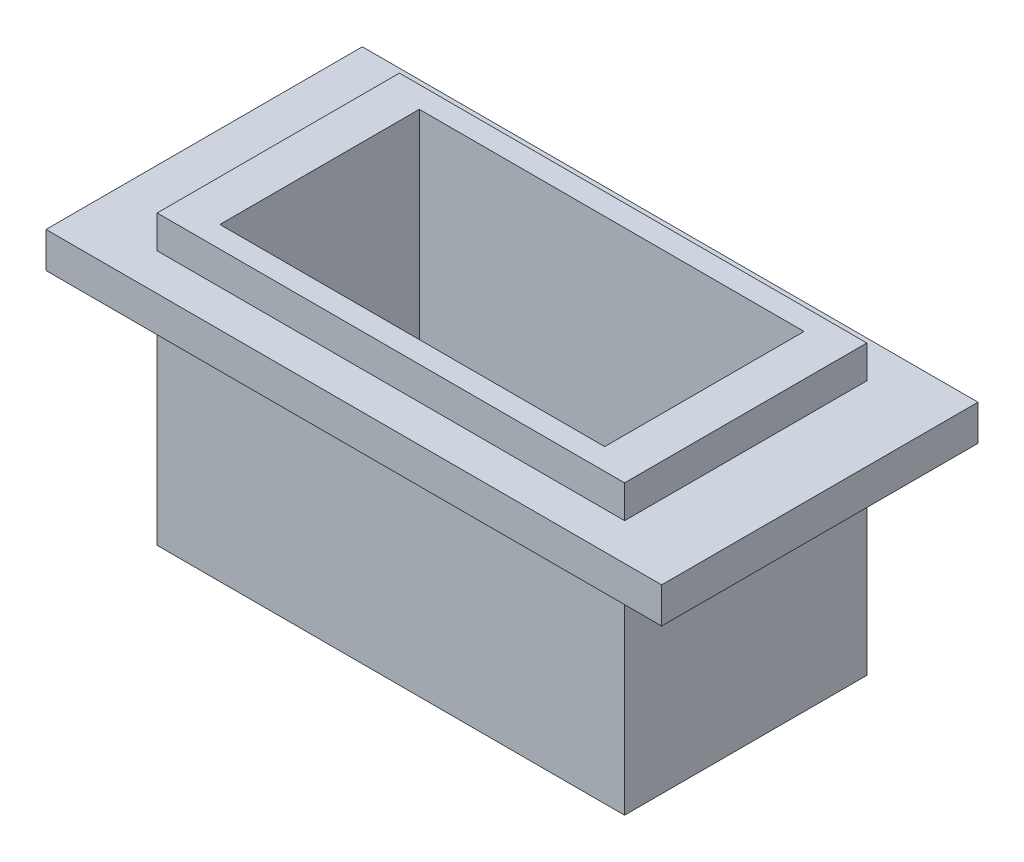
ISO-10303-21;
HEADER;
FILE_DESCRIPTION(('STEP AP214'),'2;1');
FILE_NAME('part.step','',(''),(''),'','','');
FILE_SCHEMA(('AUTOMOTIVE_DESIGN { 1 0 10303 214 1 1 1 1 }'));
ENDSEC;
DATA;
#1=APPLICATION_CONTEXT('core data for automotive mechanical design processes');
#2=APPLICATION_PROTOCOL_DEFINITION('international standard','automotive_design',2000,#1);
#3=PRODUCT_CONTEXT('',#1,'mechanical');
#4=PRODUCT('Part','Part','',(#3));
#5=PRODUCT_RELATED_PRODUCT_CATEGORY('part','',(#4));
#6=PRODUCT_DEFINITION_FORMATION('','',#4);
#7=PRODUCT_DEFINITION_CONTEXT('part definition',#1,'design');
#8=PRODUCT_DEFINITION('design','',#6,#7);
#9=PRODUCT_DEFINITION_SHAPE('','',#8);
#10=(LENGTH_UNIT() NAMED_UNIT(*) SI_UNIT(.MILLI.,.METRE.));
#11=(NAMED_UNIT(*) PLANE_ANGLE_UNIT() SI_UNIT($,.RADIAN.));
#12=(NAMED_UNIT(*) SI_UNIT($,.STERADIAN.) SOLID_ANGLE_UNIT());
#13=UNCERTAINTY_MEASURE_WITH_UNIT(LENGTH_MEASURE(1.E-05),#10,'distance_accuracy_value','');
#14=(GEOMETRIC_REPRESENTATION_CONTEXT(3) GLOBAL_UNCERTAINTY_ASSIGNED_CONTEXT((#13)) GLOBAL_UNIT_ASSIGNED_CONTEXT((#10,
#11,#12)) REPRESENTATION_CONTEXT('',''));
#15=CARTESIAN_POINT('',(0.,0.,0.));
#16=DIRECTION('',(0.,0.,1.));
#17=DIRECTION('',(1.,0.,0.));
#18=AXIS2_PLACEMENT_3D('',#15,#16,#17);
#19=CARTESIAN_POINT('',(0.,3.175,0.));
#20=DIRECTION('',(0.,0.,-1.));
#21=DIRECTION('',(-1.,0.,0.));
#22=AXIS2_PLACEMENT_3D('',#19,#20,#21);
#23=PLANE('',#22);
#24=DIRECTION('',(1.,0.,0.));
#25=VECTOR('',#24,1.);
#26=CARTESIAN_POINT('',(0.,0.,0.));
#27=LINE('',#26,#25);
#28=CARTESIAN_POINT('',(0.,0.,0.));
#29=VERTEX_POINT('',#28);
#30=CARTESIAN_POINT('',(54.864,0.,0.));
#31=VERTEX_POINT('',#30);
#32=EDGE_CURVE('E134',#29,#31,#27,.T.);
#33=ORIENTED_EDGE('',*,*,#32,.T.);
#34=DIRECTION('',(0.,-1.,0.));
#35=VECTOR('',#34,1.);
#36=CARTESIAN_POINT('',(54.864,3.175,0.));
#37=LINE('',#36,#35);
#38=CARTESIAN_POINT('',(54.864,3.175,0.));
#39=VERTEX_POINT('',#38);
#40=EDGE_CURVE('E11',#39,#31,#37,.T.);
#41=ORIENTED_EDGE('',*,*,#40,.F.);
#42=DIRECTION('',(1.,0.,0.));
#43=VECTOR('',#42,1.);
#44=CARTESIAN_POINT('',(0.,3.175,0.));
#45=LINE('',#44,#43);
#46=CARTESIAN_POINT('',(0.,3.175,0.));
#47=VERTEX_POINT('',#46);
#48=EDGE_CURVE('E151',#47,#39,#45,.T.);
#49=ORIENTED_EDGE('',*,*,#48,.F.);
#50=DIRECTION('',(0.,-1.,0.));
#51=VECTOR('',#50,1.);
#52=CARTESIAN_POINT('',(0.,3.175,0.));
#53=LINE('',#52,#51);
#54=EDGE_CURVE('E109',#47,#29,#53,.T.);
#55=ORIENTED_EDGE('',*,*,#54,.T.);
#56=EDGE_LOOP('',(#33,#41,#49,#55));
#57=FACE_BOUND('',#56,.T.);
#58=ADVANCED_FACE('F35',(#57),#23,.F.);
#59=CARTESIAN_POINT('',(54.864,3.175,0.));
#60=DIRECTION('',(-1.,0.,0.));
#61=DIRECTION('',(0.,0.,1.));
#62=AXIS2_PLACEMENT_3D('',#59,#60,#61);
#63=PLANE('',#62);
#64=DIRECTION('',(0.,0.,-1.));
#65=VECTOR('',#64,1.);
#66=CARTESIAN_POINT('',(54.864,0.,0.));
#67=LINE('',#66,#65);
#68=CARTESIAN_POINT('',(54.864,0.,-28.194));
#69=VERTEX_POINT('',#68);
#70=EDGE_CURVE('E137',#31,#69,#67,.T.);
#71=ORIENTED_EDGE('',*,*,#70,.T.);
#72=DIRECTION('',(0.,-1.,0.));
#73=VECTOR('',#72,1.);
#74=CARTESIAN_POINT('',(54.864,3.175,-28.194));
#75=LINE('',#74,#73);
#76=CARTESIAN_POINT('',(54.864,3.175,-28.194));
#77=VERTEX_POINT('',#76);
#78=EDGE_CURVE('E43',#77,#69,#75,.T.);
#79=ORIENTED_EDGE('',*,*,#78,.F.);
#80=DIRECTION('',(0.,0.,-1.));
#81=VECTOR('',#80,1.);
#82=CARTESIAN_POINT('',(54.864,3.175,0.));
#83=LINE('',#82,#81);
#84=EDGE_CURVE('E90',#39,#77,#83,.T.);
#85=ORIENTED_EDGE('',*,*,#84,.F.);
#86=ORIENTED_EDGE('',*,*,#40,.T.);
#87=EDGE_LOOP('',(#71,#79,#85,#86));
#88=FACE_BOUND('',#87,.T.);
#89=ADVANCED_FACE('F152',(#88),#63,.F.);
#90=CARTESIAN_POINT('',(0.,3.175,-28.194));
#91=DIRECTION('',(0.,0.,-1.));
#92=DIRECTION('',(-1.,0.,0.));
#93=AXIS2_PLACEMENT_3D('',#90,#91,#92);
#94=PLANE('',#93);
#95=DIRECTION('',(1.,0.,0.));
#96=VECTOR('',#95,1.);
#97=CARTESIAN_POINT('',(0.,0.,-28.194));
#98=LINE('',#97,#96);
#99=CARTESIAN_POINT('',(0.,0.,-28.194));
#100=VERTEX_POINT('',#99);
#101=EDGE_CURVE('E104',#100,#69,#98,.T.);
#102=ORIENTED_EDGE('',*,*,#101,.F.);
#103=DIRECTION('',(0.,-1.,0.));
#104=VECTOR('',#103,1.);
#105=CARTESIAN_POINT('',(0.,3.175,-28.194));
#106=LINE('',#105,#104);
#107=CARTESIAN_POINT('',(0.,3.175,-28.194));
#108=VERTEX_POINT('',#107);
#109=EDGE_CURVE('E99',#108,#100,#106,.T.);
#110=ORIENTED_EDGE('',*,*,#109,.F.);
#111=DIRECTION('',(1.,0.,0.));
#112=VECTOR('',#111,1.);
#113=CARTESIAN_POINT('',(0.,3.175,-28.194));
#114=LINE('',#113,#112);
#115=EDGE_CURVE('E102',#108,#77,#114,.T.);
#116=ORIENTED_EDGE('',*,*,#115,.T.);
#117=ORIENTED_EDGE('',*,*,#78,.T.);
#118=EDGE_LOOP('',(#102,#110,#116,#117));
#119=FACE_BOUND('',#118,.T.);
#120=ADVANCED_FACE('F101',(#119),#94,.T.);
#121=CARTESIAN_POINT('',(0.,3.175,0.));
#122=DIRECTION('',(-1.,0.,0.));
#123=DIRECTION('',(0.,0.,1.));
#124=AXIS2_PLACEMENT_3D('',#121,#122,#123);
#125=PLANE('',#124);
#126=DIRECTION('',(0.,0.,-1.));
#127=VECTOR('',#126,1.);
#128=CARTESIAN_POINT('',(0.,0.,0.));
#129=LINE('',#128,#127);
#130=EDGE_CURVE('E142',#29,#100,#129,.T.);
#131=ORIENTED_EDGE('',*,*,#130,.F.);
#132=ORIENTED_EDGE('',*,*,#54,.F.);
#133=DIRECTION('',(0.,0.,-1.));
#134=VECTOR('',#133,1.);
#135=CARTESIAN_POINT('',(0.,3.175,0.));
#136=LINE('',#135,#134);
#137=EDGE_CURVE('E115',#47,#108,#136,.T.);
#138=ORIENTED_EDGE('',*,*,#137,.T.);
#139=ORIENTED_EDGE('',*,*,#109,.T.);
#140=EDGE_LOOP('',(#131,#132,#138,#139));
#141=FACE_BOUND('',#140,.T.);
#142=ADVANCED_FACE('F117',(#141),#125,.T.);
#143=CARTESIAN_POINT('',(0.,3.175,0.));
#144=DIRECTION('',(0.,1.,0.));
#145=DIRECTION('',(0.,0.,1.));
#146=AXIS2_PLACEMENT_3D('',#143,#144,#145);
#147=PLANE('',#146);
#148=ORIENTED_EDGE('',*,*,#48,.T.);
#149=ORIENTED_EDGE('',*,*,#84,.T.);
#150=ORIENTED_EDGE('',*,*,#115,.F.);
#151=ORIENTED_EDGE('',*,*,#137,.F.);
#152=EDGE_LOOP('',(#148,#149,#150,#151));
#153=FACE_BOUND('',#152,.T.);
#154=DIRECTION('',(-1.,0.,0.));
#155=VECTOR('',#154,1.);
#156=CARTESIAN_POINT('',(0.,3.175,-3.302));
#157=LINE('',#156,#155);
#158=CARTESIAN_POINT('',(48.26,3.175,-3.302));
#159=VERTEX_POINT('',#158);
#160=CARTESIAN_POINT('',(6.60400000000001,3.175,-3.302));
#161=VERTEX_POINT('',#160);
#162=EDGE_CURVE('E119',#159,#161,#157,.T.);
#163=ORIENTED_EDGE('',*,*,#162,.T.);
#164=DIRECTION('',(0.,0.,-1.));
#165=VECTOR('',#164,1.);
#166=CARTESIAN_POINT('',(6.60400000000001,3.175,0.));
#167=LINE('',#166,#165);
#168=CARTESIAN_POINT('',(6.60400000000001,3.175,-24.892));
#169=VERTEX_POINT('',#168);
#170=EDGE_CURVE('E122',#161,#169,#167,.T.);
#171=ORIENTED_EDGE('',*,*,#170,.T.);
#172=DIRECTION('',(-1.,0.,0.));
#173=VECTOR('',#172,1.);
#174=CARTESIAN_POINT('',(0.,3.175,-24.892));
#175=LINE('',#174,#173);
#176=CARTESIAN_POINT('',(48.26,3.175,-24.892));
#177=VERTEX_POINT('',#176);
#178=EDGE_CURVE('E128',#177,#169,#175,.T.);
#179=ORIENTED_EDGE('',*,*,#178,.F.);
#180=DIRECTION('',(0.,0.,-1.));
#181=VECTOR('',#180,1.);
#182=CARTESIAN_POINT('',(48.26,3.175,0.));
#183=LINE('',#182,#181);
#184=EDGE_CURVE('E131',#159,#177,#183,.T.);
#185=ORIENTED_EDGE('',*,*,#184,.F.);
#186=EDGE_LOOP('',(#163,#171,#179,#185));
#187=FACE_BOUND('',#186,.T.);
#188=ADVANCED_FACE('F113',(#153,#187),#147,.T.);
#189=CARTESIAN_POINT('',(0.,0.,0.));
#190=DIRECTION('',(0.,1.,0.));
#191=DIRECTION('',(0.,0.,1.));
#192=AXIS2_PLACEMENT_3D('',#189,#190,#191);
#193=PLANE('',#192);
#194=ORIENTED_EDGE('',*,*,#32,.F.);
#195=ORIENTED_EDGE('',*,*,#130,.T.);
#196=ORIENTED_EDGE('',*,*,#101,.T.);
#197=ORIENTED_EDGE('',*,*,#70,.F.);
#198=EDGE_LOOP('',(#194,#195,#196,#197));
#199=FACE_BOUND('',#198,.T.);
#200=DIRECTION('',(-1.,0.,0.));
#201=VECTOR('',#200,1.);
#202=CARTESIAN_POINT('',(0.,0.,-3.302));
#203=LINE('',#202,#201);
#204=CARTESIAN_POINT('',(48.26,0.,-3.302));
#205=VERTEX_POINT('',#204);
#206=CARTESIAN_POINT('',(6.60400000000001,0.,-3.302));
#207=VERTEX_POINT('',#206);
#208=EDGE_CURVE('E83',#205,#207,#203,.T.);
#209=ORIENTED_EDGE('',*,*,#208,.F.);
#210=DIRECTION('',(0.,0.,-1.));
#211=VECTOR('',#210,1.);
#212=CARTESIAN_POINT('',(48.26,0.,0.));
#213=LINE('',#212,#211);
#214=CARTESIAN_POINT('',(48.26,0.,-24.892));
#215=VERTEX_POINT('',#214);
#216=EDGE_CURVE('E78',#205,#215,#213,.T.);
#217=ORIENTED_EDGE('',*,*,#216,.T.);
#218=DIRECTION('',(-1.,0.,0.));
#219=VECTOR('',#218,1.);
#220=CARTESIAN_POINT('',(0.,0.,-24.892));
#221=LINE('',#220,#219);
#222=CARTESIAN_POINT('',(6.60400000000001,0.,-24.892));
#223=VERTEX_POINT('',#222);
#224=EDGE_CURVE('E148',#215,#223,#221,.T.);
#225=ORIENTED_EDGE('',*,*,#224,.T.);
#226=DIRECTION('',(0.,0.,-1.));
#227=VECTOR('',#226,1.);
#228=CARTESIAN_POINT('',(6.60400000000001,0.,0.));
#229=LINE('',#228,#227);
#230=EDGE_CURVE('E145',#207,#223,#229,.T.);
#231=ORIENTED_EDGE('',*,*,#230,.F.);
#232=EDGE_LOOP('',(#209,#217,#225,#231));
#233=FACE_BOUND('',#232,.T.);
#234=ADVANCED_FACE('F156',(#199,#233),#193,.F.);
#235=CARTESIAN_POINT('',(6.60400000000001,-19.558,0.));
#236=DIRECTION('',(1.,0.,0.));
#237=DIRECTION('',(0.,0.,-1.));
#238=AXIS2_PLACEMENT_3D('',#235,#236,#237);
#239=PLANE('',#238);
#240=DIRECTION('',(0.,1.,0.));
#241=VECTOR('',#240,1.);
#242=CARTESIAN_POINT('',(6.60400000000001,-19.558,-3.302));
#243=LINE('',#242,#241);
#244=CARTESIAN_POINT('',(6.60400000000001,-19.558,-3.302));
#245=VERTEX_POINT('',#244);
#246=EDGE_CURVE('E173',#245,#207,#243,.T.);
#247=ORIENTED_EDGE('',*,*,#246,.T.);
#248=ORIENTED_EDGE('',*,*,#230,.T.);
#249=DIRECTION('',(0.,1.,0.));
#250=VECTOR('',#249,1.);
#251=CARTESIAN_POINT('',(6.60400000000001,-19.558,-24.892));
#252=LINE('',#251,#250);
#253=CARTESIAN_POINT('',(6.60400000000001,-19.558,-24.892));
#254=VERTEX_POINT('',#253);
#255=EDGE_CURVE('E138',#254,#223,#252,.T.);
#256=ORIENTED_EDGE('',*,*,#255,.F.);
#257=DIRECTION('',(0.,0.,-1.));
#258=VECTOR('',#257,1.);
#259=CARTESIAN_POINT('',(6.60400000000001,-19.558,0.));
#260=LINE('',#259,#258);
#261=EDGE_CURVE('E195',#245,#254,#260,.T.);
#262=ORIENTED_EDGE('',*,*,#261,.F.);
#263=EDGE_LOOP('',(#247,#248,#256,#262));
#264=FACE_BOUND('',#263,.T.);
#265=ADVANCED_FACE('F335',(#264),#239,.F.);
#266=CARTESIAN_POINT('',(0.,-19.558,-24.892));
#267=DIRECTION('',(0.,0.,-1.));
#268=DIRECTION('',(-1.,0.,0.));
#269=AXIS2_PLACEMENT_3D('',#266,#267,#268);
#270=PLANE('',#269);
#271=ORIENTED_EDGE('',*,*,#224,.F.);
#272=DIRECTION('',(0.,1.,0.));
#273=VECTOR('',#272,1.);
#274=CARTESIAN_POINT('',(48.26,-19.558,-24.892));
#275=LINE('',#274,#273);
#276=CARTESIAN_POINT('',(48.26,-19.558,-24.892));
#277=VERTEX_POINT('',#276);
#278=EDGE_CURVE('E181',#277,#215,#275,.T.);
#279=ORIENTED_EDGE('',*,*,#278,.F.);
#280=DIRECTION('',(-1.,0.,0.));
#281=VECTOR('',#280,1.);
#282=CARTESIAN_POINT('',(0.,-19.558,-24.892));
#283=LINE('',#282,#281);
#284=EDGE_CURVE('E164',#277,#254,#283,.T.);
#285=ORIENTED_EDGE('',*,*,#284,.T.);
#286=ORIENTED_EDGE('',*,*,#255,.T.);
#287=EDGE_LOOP('',(#271,#279,#285,#286));
#288=FACE_BOUND('',#287,.T.);
#289=ADVANCED_FACE('F355',(#288),#270,.T.);
#290=CARTESIAN_POINT('',(48.26,-19.558,0.));
#291=DIRECTION('',(1.,0.,0.));
#292=DIRECTION('',(0.,0.,-1.));
#293=AXIS2_PLACEMENT_3D('',#290,#291,#292);
#294=PLANE('',#293);
#295=ORIENTED_EDGE('',*,*,#216,.F.);
#296=DIRECTION('',(0.,1.,0.));
#297=VECTOR('',#296,1.);
#298=CARTESIAN_POINT('',(48.26,-19.558,-3.302));
#299=LINE('',#298,#297);
#300=CARTESIAN_POINT('',(48.26,-19.558,-3.302));
#301=VERTEX_POINT('',#300);
#302=EDGE_CURVE('E177',#301,#205,#299,.T.);
#303=ORIENTED_EDGE('',*,*,#302,.F.);
#304=DIRECTION('',(0.,0.,-1.));
#305=VECTOR('',#304,1.);
#306=CARTESIAN_POINT('',(48.26,-19.558,0.));
#307=LINE('',#306,#305);
#308=EDGE_CURVE('E189',#301,#277,#307,.T.);
#309=ORIENTED_EDGE('',*,*,#308,.T.);
#310=ORIENTED_EDGE('',*,*,#278,.T.);
#311=EDGE_LOOP('',(#295,#303,#309,#310));
#312=FACE_BOUND('',#311,.T.);
#313=ADVANCED_FACE('F353',(#312),#294,.T.);
#314=CARTESIAN_POINT('',(0.,-19.558,-3.302));
#315=DIRECTION('',(0.,0.,-1.));
#316=DIRECTION('',(-1.,0.,0.));
#317=AXIS2_PLACEMENT_3D('',#314,#315,#316);
#318=PLANE('',#317);
#319=ORIENTED_EDGE('',*,*,#302,.T.);
#320=ORIENTED_EDGE('',*,*,#208,.T.);
#321=ORIENTED_EDGE('',*,*,#246,.F.);
#322=DIRECTION('',(-1.,0.,0.));
#323=VECTOR('',#322,1.);
#324=CARTESIAN_POINT('',(0.,-19.558,-3.302));
#325=LINE('',#324,#323);
#326=EDGE_CURVE('E192',#301,#245,#325,.T.);
#327=ORIENTED_EDGE('',*,*,#326,.F.);
#328=EDGE_LOOP('',(#319,#320,#321,#327));
#329=FACE_BOUND('',#328,.T.);
#330=ADVANCED_FACE('F348',(#329),#318,.F.);
#331=ORIENTED_EDGE('',*,*,#170,.F.);
#332=CARTESIAN_POINT('',(6.60400000000001,6.096,-3.302));
#333=VERTEX_POINT('',#332);
#334=EDGE_CURVE('E51',#161,#333,#243,.T.);
#335=ORIENTED_EDGE('',*,*,#334,.T.);
#336=DIRECTION('',(0.,0.,-1.));
#337=VECTOR('',#336,1.);
#338=CARTESIAN_POINT('',(6.60400000000001,6.096,0.));
#339=LINE('',#338,#337);
#340=CARTESIAN_POINT('',(6.60400000000001,6.096,-24.892));
#341=VERTEX_POINT('',#340);
#342=EDGE_CURVE('E218',#333,#341,#339,.T.);
#343=ORIENTED_EDGE('',*,*,#342,.T.);
#344=EDGE_CURVE('E184',#169,#341,#252,.T.);
#345=ORIENTED_EDGE('',*,*,#344,.F.);
#346=EDGE_LOOP('',(#331,#335,#343,#345));
#347=FACE_BOUND('',#346,.T.);
#348=ADVANCED_FACE('F303',(#347),#239,.F.);
#349=CARTESIAN_POINT('',(48.26,6.096,-24.892));
#350=VERTEX_POINT('',#349);
#351=EDGE_CURVE('E180',#177,#350,#275,.T.);
#352=ORIENTED_EDGE('',*,*,#351,.F.);
#353=ORIENTED_EDGE('',*,*,#178,.T.);
#354=ORIENTED_EDGE('',*,*,#344,.T.);
#355=DIRECTION('',(-1.,0.,0.));
#356=VECTOR('',#355,1.);
#357=CARTESIAN_POINT('',(0.,6.096,-24.892));
#358=LINE('',#357,#356);
#359=EDGE_CURVE('E210',#350,#341,#358,.T.);
#360=ORIENTED_EDGE('',*,*,#359,.F.);
#361=EDGE_LOOP('',(#352,#353,#354,#360));
#362=FACE_BOUND('',#361,.T.);
#363=ADVANCED_FACE('F299',(#362),#270,.T.);
#364=CARTESIAN_POINT('',(48.26,6.096,-3.302));
#365=VERTEX_POINT('',#364);
#366=EDGE_CURVE('E176',#159,#365,#299,.T.);
#367=ORIENTED_EDGE('',*,*,#366,.F.);
#368=ORIENTED_EDGE('',*,*,#184,.T.);
#369=ORIENTED_EDGE('',*,*,#351,.T.);
#370=DIRECTION('',(0.,0.,-1.));
#371=VECTOR('',#370,1.);
#372=CARTESIAN_POINT('',(48.26,6.096,0.));
#373=LINE('',#372,#371);
#374=EDGE_CURVE('E213',#365,#350,#373,.T.);
#375=ORIENTED_EDGE('',*,*,#374,.F.);
#376=EDGE_LOOP('',(#367,#368,#369,#375));
#377=FACE_BOUND('',#376,.T.);
#378=ADVANCED_FACE('F309',(#377),#294,.T.);
#379=CARTESIAN_POINT('',(44.577,-19.558,0.));
#380=DIRECTION('',(1.,0.,0.));
#381=DIRECTION('',(0.,0.,-1.));
#382=AXIS2_PLACEMENT_3D('',#379,#380,#381);
#383=PLANE('',#382);
#384=DIRECTION('',(0.,1.,0.));
#385=VECTOR('',#384,1.);
#386=CARTESIAN_POINT('',(44.577,-19.558,-5.21087195121952));
#387=LINE('',#386,#385);
#388=CARTESIAN_POINT('',(44.577,-19.558,-5.21087195121952));
#389=VERTEX_POINT('',#388);
#390=CARTESIAN_POINT('',(44.577,6.096,-5.21087195121952));
#391=VERTEX_POINT('',#390);
#392=EDGE_CURVE('E160',#389,#391,#387,.T.);
#393=ORIENTED_EDGE('',*,*,#392,.T.);
#394=DIRECTION('',(0.,0.,-1.));
#395=VECTOR('',#394,1.);
#396=CARTESIAN_POINT('',(44.577,6.096,0.));
#397=LINE('',#396,#395);
#398=CARTESIAN_POINT('',(44.577,6.096,-22.9831280487805));
#399=VERTEX_POINT('',#398);
#400=EDGE_CURVE('E230',#391,#399,#397,.T.);
#401=ORIENTED_EDGE('',*,*,#400,.T.);
#402=DIRECTION('',(0.,1.,0.));
#403=VECTOR('',#402,1.);
#404=CARTESIAN_POINT('',(44.577,-19.558,-22.9831280487805));
#405=LINE('',#404,#403);
#406=CARTESIAN_POINT('',(44.577,-19.558,-22.9831280487805));
#407=VERTEX_POINT('',#406);
#408=EDGE_CURVE('E170',#407,#399,#405,.T.);
#409=ORIENTED_EDGE('',*,*,#408,.F.);
#410=DIRECTION('',(0.,0.,-1.));
#411=VECTOR('',#410,1.);
#412=CARTESIAN_POINT('',(44.577,-19.558,0.));
#413=LINE('',#412,#411);
#414=EDGE_CURVE('E207',#389,#407,#413,.T.);
#415=ORIENTED_EDGE('',*,*,#414,.F.);
#416=EDGE_LOOP('',(#393,#401,#409,#415));
#417=FACE_BOUND('',#416,.T.);
#418=ADVANCED_FACE('F236',(#417),#383,.F.);
#419=CARTESIAN_POINT('',(0.,-19.558,-22.9831280487805));
#420=DIRECTION('',(0.,0.,1.));
#421=DIRECTION('',(1.,0.,0.));
#422=AXIS2_PLACEMENT_3D('',#419,#420,#421);
#423=PLANE('',#422);
#424=ORIENTED_EDGE('',*,*,#408,.T.);
#425=DIRECTION('',(1.,0.,0.));
#426=VECTOR('',#425,1.);
#427=CARTESIAN_POINT('',(0.,6.096,-22.9831280487805));
#428=LINE('',#427,#426);
#429=CARTESIAN_POINT('',(10.287,6.096,-22.9831280487805));
#430=VERTEX_POINT('',#429);
#431=EDGE_CURVE('E221',#430,#399,#428,.T.);
#432=ORIENTED_EDGE('',*,*,#431,.F.);
#433=DIRECTION('',(0.,1.,0.));
#434=VECTOR('',#433,1.);
#435=CARTESIAN_POINT('',(10.287,-19.558,-22.9831280487805));
#436=LINE('',#435,#434);
#437=CARTESIAN_POINT('',(10.287,-19.558,-22.9831280487805));
#438=VERTEX_POINT('',#437);
#439=EDGE_CURVE('E167',#438,#430,#436,.T.);
#440=ORIENTED_EDGE('',*,*,#439,.F.);
#441=DIRECTION('',(1.,0.,0.));
#442=VECTOR('',#441,1.);
#443=CARTESIAN_POINT('',(0.,-19.558,-22.9831280487805));
#444=LINE('',#443,#442);
#445=EDGE_CURVE('E198',#438,#407,#444,.T.);
#446=ORIENTED_EDGE('',*,*,#445,.T.);
#447=EDGE_LOOP('',(#424,#432,#440,#446));
#448=FACE_BOUND('',#447,.T.);
#449=ADVANCED_FACE('F265',(#448),#423,.T.);
#450=CARTESIAN_POINT('',(10.287,-19.558,0.));
#451=DIRECTION('',(1.,0.,0.));
#452=DIRECTION('',(0.,0.,-1.));
#453=AXIS2_PLACEMENT_3D('',#450,#451,#452);
#454=PLANE('',#453);
#455=ORIENTED_EDGE('',*,*,#439,.T.);
#456=DIRECTION('',(0.,0.,-1.));
#457=VECTOR('',#456,1.);
#458=CARTESIAN_POINT('',(10.287,6.096,0.));
#459=LINE('',#458,#457);
#460=CARTESIAN_POINT('',(10.287,6.096,-5.21087195121952));
#461=VERTEX_POINT('',#460);
#462=EDGE_CURVE('E224',#461,#430,#459,.T.);
#463=ORIENTED_EDGE('',*,*,#462,.F.);
#464=DIRECTION('',(0.,1.,0.));
#465=VECTOR('',#464,1.);
#466=CARTESIAN_POINT('',(10.287,-19.558,-5.21087195121952));
#467=LINE('',#466,#465);
#468=CARTESIAN_POINT('',(10.287,-19.558,-5.21087195121952));
#469=VERTEX_POINT('',#468);
#470=EDGE_CURVE('E163',#469,#461,#467,.T.);
#471=ORIENTED_EDGE('',*,*,#470,.F.);
#472=DIRECTION('',(0.,0.,-1.));
#473=VECTOR('',#472,1.);
#474=CARTESIAN_POINT('',(10.287,-19.558,0.));
#475=LINE('',#474,#473);
#476=EDGE_CURVE('E201',#469,#438,#475,.T.);
#477=ORIENTED_EDGE('',*,*,#476,.T.);
#478=EDGE_LOOP('',(#455,#463,#471,#477));
#479=FACE_BOUND('',#478,.T.);
#480=ADVANCED_FACE('F261',(#479),#454,.T.);
#481=CARTESIAN_POINT('',(0.,-19.558,-5.21087195121952));
#482=DIRECTION('',(0.,0.,1.));
#483=DIRECTION('',(1.,0.,0.));
#484=AXIS2_PLACEMENT_3D('',#481,#482,#483);
#485=PLANE('',#484);
#486=ORIENTED_EDGE('',*,*,#470,.T.);
#487=DIRECTION('',(1.,0.,0.));
#488=VECTOR('',#487,1.);
#489=CARTESIAN_POINT('',(0.,6.096,-5.21087195121952));
#490=LINE('',#489,#488);
#491=EDGE_CURVE('E227',#461,#391,#490,.T.);
#492=ORIENTED_EDGE('',*,*,#491,.T.);
#493=ORIENTED_EDGE('',*,*,#392,.F.);
#494=DIRECTION('',(1.,0.,0.));
#495=VECTOR('',#494,1.);
#496=CARTESIAN_POINT('',(0.,-19.558,-5.21087195121952));
#497=LINE('',#496,#495);
#498=EDGE_CURVE('E204',#469,#389,#497,.T.);
#499=ORIENTED_EDGE('',*,*,#498,.F.);
#500=EDGE_LOOP('',(#486,#492,#493,#499));
#501=FACE_BOUND('',#500,.T.);
#502=ADVANCED_FACE('F252',(#501),#485,.F.);
#503=ORIENTED_EDGE('',*,*,#162,.F.);
#504=ORIENTED_EDGE('',*,*,#366,.T.);
#505=DIRECTION('',(-1.,0.,0.));
#506=VECTOR('',#505,1.);
#507=CARTESIAN_POINT('',(0.,6.096,-3.302));
#508=LINE('',#507,#506);
#509=EDGE_CURVE('E216',#365,#333,#508,.T.);
#510=ORIENTED_EDGE('',*,*,#509,.T.);
#511=ORIENTED_EDGE('',*,*,#334,.F.);
#512=EDGE_LOOP('',(#503,#504,#510,#511));
#513=FACE_BOUND('',#512,.T.);
#514=ADVANCED_FACE('F306',(#513),#318,.F.);
#515=CARTESIAN_POINT('',(0.,-19.558,0.));
#516=DIRECTION('',(0.,1.,0.));
#517=DIRECTION('',(0.,0.,1.));
#518=AXIS2_PLACEMENT_3D('',#515,#516,#517);
#519=PLANE('',#518);
#520=ORIENTED_EDGE('',*,*,#414,.T.);
#521=ORIENTED_EDGE('',*,*,#445,.F.);
#522=ORIENTED_EDGE('',*,*,#476,.F.);
#523=ORIENTED_EDGE('',*,*,#498,.T.);
#524=EDGE_LOOP('',(#520,#521,#522,#523));
#525=FACE_BOUND('',#524,.T.);
#526=ORIENTED_EDGE('',*,*,#261,.T.);
#527=ORIENTED_EDGE('',*,*,#284,.F.);
#528=ORIENTED_EDGE('',*,*,#308,.F.);
#529=ORIENTED_EDGE('',*,*,#326,.T.);
#530=EDGE_LOOP('',(#526,#527,#528,#529));
#531=FACE_BOUND('',#530,.T.);
#532=ADVANCED_FACE('F271',(#525,#531),#519,.F.);
#533=CARTESIAN_POINT('',(0.,6.096,0.));
#534=DIRECTION('',(0.,1.,0.));
#535=DIRECTION('',(0.,0.,1.));
#536=AXIS2_PLACEMENT_3D('',#533,#534,#535);
#537=PLANE('',#536);
#538=ORIENTED_EDGE('',*,*,#400,.F.);
#539=ORIENTED_EDGE('',*,*,#491,.F.);
#540=ORIENTED_EDGE('',*,*,#462,.T.);
#541=ORIENTED_EDGE('',*,*,#431,.T.);
#542=EDGE_LOOP('',(#538,#539,#540,#541));
#543=FACE_BOUND('',#542,.T.);
#544=ORIENTED_EDGE('',*,*,#342,.F.);
#545=ORIENTED_EDGE('',*,*,#509,.F.);
#546=ORIENTED_EDGE('',*,*,#374,.T.);
#547=ORIENTED_EDGE('',*,*,#359,.T.);
#548=EDGE_LOOP('',(#544,#545,#546,#547));
#549=FACE_BOUND('',#548,.T.);
#550=ADVANCED_FACE('F246',(#543,#549),#537,.T.);
#551=CLOSED_SHELL('',(#58,#89,#120,#142,#188,#234,#265,#289,#313,#330,#348,#363,#378,#418,#449,
#480,#502,#514,#532,#550));
#552=MANIFOLD_SOLID_BREP('B2',#551);
#553=ADVANCED_BREP_SHAPE_REPRESENTATION('',(#18,#552),#14);
#554=SHAPE_DEFINITION_REPRESENTATION(#9,#553);
ENDSEC;
END-ISO-10303-21;
